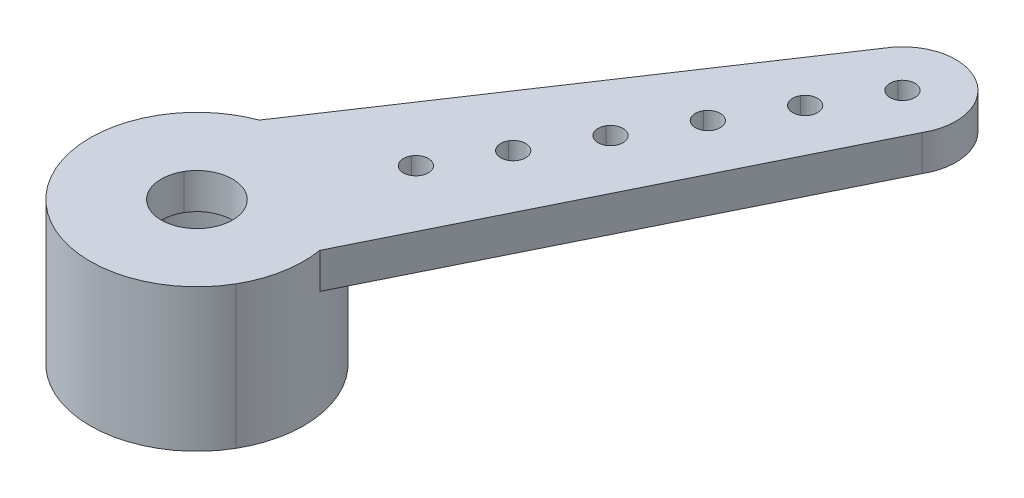
ISO-10303-21;
HEADER;
FILE_DESCRIPTION(('STEP AP214'),'2;1');
FILE_NAME('part.step','',(''),(''),'','','');
FILE_SCHEMA(('AUTOMOTIVE_DESIGN { 1 0 10303 214 1 1 1 1 }'));
ENDSEC;
DATA;
#1=APPLICATION_CONTEXT('core data for automotive mechanical design processes');
#2=APPLICATION_PROTOCOL_DEFINITION('international standard','automotive_design',2000,#1);
#3=PRODUCT_CONTEXT('',#1,'mechanical');
#4=PRODUCT('Part','Part','',(#3));
#5=PRODUCT_RELATED_PRODUCT_CATEGORY('part','',(#4));
#6=PRODUCT_DEFINITION_FORMATION('','',#4);
#7=PRODUCT_DEFINITION_CONTEXT('part definition',#1,'design');
#8=PRODUCT_DEFINITION('design','',#6,#7);
#9=PRODUCT_DEFINITION_SHAPE('','',#8);
#10=(LENGTH_UNIT() NAMED_UNIT(*) SI_UNIT(.MILLI.,.METRE.));
#11=(NAMED_UNIT(*) PLANE_ANGLE_UNIT() SI_UNIT($,.RADIAN.));
#12=(NAMED_UNIT(*) SI_UNIT($,.STERADIAN.) SOLID_ANGLE_UNIT());
#13=UNCERTAINTY_MEASURE_WITH_UNIT(LENGTH_MEASURE(1.E-05),#10,'distance_accuracy_value','');
#14=(GEOMETRIC_REPRESENTATION_CONTEXT(3) GLOBAL_UNCERTAINTY_ASSIGNED_CONTEXT((#13)) GLOBAL_UNIT_ASSIGNED_CONTEXT((#10,
#11,#12)) REPRESENTATION_CONTEXT('',''));
#15=CARTESIAN_POINT('',(0.,0.,0.));
#16=DIRECTION('',(0.,0.,1.));
#17=DIRECTION('',(1.,0.,0.));
#18=AXIS2_PLACEMENT_3D('',#15,#16,#17);
#19=CARTESIAN_POINT('',(-40.75,54.,-3.89711431703));
#20=DIRECTION('',(0.,1.,0.));
#21=DIRECTION('',(-0.866025403784329,0.,-0.50000000000019));
#22=AXIS2_PLACEMENT_3D('',#19,#20,#21);
#23=CYLINDRICAL_SURFACE('',#22,0.35);
#24=DIRECTION('',(0.,1.,0.));
#25=VECTOR('',#24,1.);
#26=CARTESIAN_POINT('',(-40.44689110867,54.,-3.72211431703));
#27=LINE('',#26,#25);
#28=CARTESIAN_POINT('',(-40.44689110867,54.,-3.72211431703));
#29=VERTEX_POINT('',#28);
#30=CARTESIAN_POINT('',(-40.44689110867,55.,-3.72211431703));
#31=VERTEX_POINT('',#30);
#32=EDGE_CURVE('E607',#29,#31,#27,.T.);
#33=ORIENTED_EDGE('',*,*,#32,.F.);
#34=CARTESIAN_POINT('',(-40.75,54.,-3.89711431703));
#35=DIRECTION('',(0.,-1.,0.));
#36=DIRECTION('',(0.866025403784329,0.,0.50000000000019));
#37=AXIS2_PLACEMENT_3D('',#34,#35,#36);
#38=CIRCLE('',#37,0.35);
#39=CARTESIAN_POINT('',(-41.05310889132,54.,-4.07211431703));
#40=VERTEX_POINT('',#39);
#41=EDGE_CURVE('E254',#29,#40,#38,.T.);
#42=ORIENTED_EDGE('',*,*,#41,.T.);
#43=DIRECTION('',(0.,1.,0.));
#44=VECTOR('',#43,1.);
#45=CARTESIAN_POINT('',(-41.05310889132,54.,-4.07211431703));
#46=LINE('',#45,#44);
#47=CARTESIAN_POINT('',(-41.05310889132,55.,-4.07211431703));
#48=VERTEX_POINT('',#47);
#49=EDGE_CURVE('E595',#40,#48,#46,.T.);
#50=ORIENTED_EDGE('',*,*,#49,.T.);
#51=CARTESIAN_POINT('',(-40.75,55.,-3.89711431703));
#52=DIRECTION('',(0.,-1.,0.));
#53=DIRECTION('',(0.866025403784329,0.,0.50000000000019));
#54=AXIS2_PLACEMENT_3D('',#51,#52,#53);
#55=CIRCLE('',#54,0.35);
#56=EDGE_CURVE('E234',#31,#48,#55,.T.);
#57=ORIENTED_EDGE('',*,*,#56,.F.);
#58=EDGE_LOOP('',(#33,#42,#50,#57));
#59=FACE_BOUND('',#58,.T.);
#60=ADVANCED_FACE('F16',(#59),#23,.F.);
#61=CARTESIAN_POINT('',(-39.75,54.,-5.629165124599));
#62=DIRECTION('',(0.,1.,0.));
#63=DIRECTION('',(-0.866025403784329,0.,-0.50000000000019));
#64=AXIS2_PLACEMENT_3D('',#61,#62,#63);
#65=CYLINDRICAL_SURFACE('',#64,0.35);
#66=DIRECTION('',(0.,1.,0.));
#67=VECTOR('',#66,1.);
#68=CARTESIAN_POINT('',(-39.44689110867,54.,-5.454165124599));
#69=LINE('',#68,#67);
#70=CARTESIAN_POINT('',(-39.44689110867,54.,-5.454165124599));
#71=VERTEX_POINT('',#70);
#72=CARTESIAN_POINT('',(-39.44689110867,55.,-5.454165124599));
#73=VERTEX_POINT('',#72);
#74=EDGE_CURVE('E579',#71,#73,#69,.T.);
#75=ORIENTED_EDGE('',*,*,#74,.F.);
#76=CARTESIAN_POINT('',(-39.75,54.,-5.629165124599));
#77=DIRECTION('',(0.,-1.,0.));
#78=DIRECTION('',(0.866025403784329,0.,0.50000000000019));
#79=AXIS2_PLACEMENT_3D('',#76,#77,#78);
#80=CIRCLE('',#79,0.35);
#81=CARTESIAN_POINT('',(-40.05310889132,54.,-5.804165124599));
#82=VERTEX_POINT('',#81);
#83=EDGE_CURVE('E241',#71,#82,#80,.T.);
#84=ORIENTED_EDGE('',*,*,#83,.T.);
#85=DIRECTION('',(0.,1.,0.));
#86=VECTOR('',#85,1.);
#87=CARTESIAN_POINT('',(-40.05310889132,54.,-5.804165124599));
#88=LINE('',#87,#86);
#89=CARTESIAN_POINT('',(-40.05310889132,55.,-5.804165124599));
#90=VERTEX_POINT('',#89);
#91=EDGE_CURVE('E568',#82,#90,#88,.T.);
#92=ORIENTED_EDGE('',*,*,#91,.T.);
#93=CARTESIAN_POINT('',(-39.75,55.,-5.629165124599));
#94=DIRECTION('',(0.,-1.,0.));
#95=DIRECTION('',(0.866025403784329,0.,0.50000000000019));
#96=AXIS2_PLACEMENT_3D('',#93,#94,#95);
#97=CIRCLE('',#96,0.35);
#98=EDGE_CURVE('E228',#73,#90,#97,.T.);
#99=ORIENTED_EDGE('',*,*,#98,.F.);
#100=EDGE_LOOP('',(#75,#84,#92,#99));
#101=FACE_BOUND('',#100,.T.);
#102=ADVANCED_FACE('F713',(#101),#65,.F.);
#103=CARTESIAN_POINT('',(-38.75,54.,-7.361215932168));
#104=DIRECTION('',(0.,1.,0.));
#105=DIRECTION('',(-0.866025403784329,0.,-0.50000000000019));
#106=AXIS2_PLACEMENT_3D('',#103,#104,#105);
#107=CYLINDRICAL_SURFACE('',#106,0.35);
#108=DIRECTION('',(0.,1.,0.));
#109=VECTOR('',#108,1.);
#110=CARTESIAN_POINT('',(-38.44689110867,54.,-7.186215932168));
#111=LINE('',#110,#109);
#112=CARTESIAN_POINT('',(-38.44689110867,54.,-7.186215932168));
#113=VERTEX_POINT('',#112);
#114=CARTESIAN_POINT('',(-38.44689110867,55.,-7.186215932168));
#115=VERTEX_POINT('',#114);
#116=EDGE_CURVE('E556',#113,#115,#111,.T.);
#117=ORIENTED_EDGE('',*,*,#116,.F.);
#118=CARTESIAN_POINT('',(-38.75,54.,-7.361215932168));
#119=DIRECTION('',(0.,-1.,0.));
#120=DIRECTION('',(0.866025403784329,0.,0.50000000000019));
#121=AXIS2_PLACEMENT_3D('',#118,#119,#120);
#122=CIRCLE('',#121,0.35);
#123=CARTESIAN_POINT('',(-39.05310889132,54.,-7.536215932168));
#124=VERTEX_POINT('',#123);
#125=EDGE_CURVE('E252',#113,#124,#122,.T.);
#126=ORIENTED_EDGE('',*,*,#125,.T.);
#127=DIRECTION('',(0.,1.,0.));
#128=VECTOR('',#127,1.);
#129=CARTESIAN_POINT('',(-39.05310889132,54.,-7.536215932168));
#130=LINE('',#129,#128);
#131=CARTESIAN_POINT('',(-39.05310889132,55.,-7.536215932168));
#132=VERTEX_POINT('',#131);
#133=EDGE_CURVE('E545',#124,#132,#130,.T.);
#134=ORIENTED_EDGE('',*,*,#133,.T.);
#135=CARTESIAN_POINT('',(-38.75,55.,-7.361215932168));
#136=DIRECTION('',(0.,-1.,0.));
#137=DIRECTION('',(0.866025403784329,0.,0.50000000000019));
#138=AXIS2_PLACEMENT_3D('',#135,#136,#137);
#139=CIRCLE('',#138,0.35);
#140=EDGE_CURVE('E226',#115,#132,#139,.T.);
#141=ORIENTED_EDGE('',*,*,#140,.F.);
#142=EDGE_LOOP('',(#117,#126,#134,#141));
#143=FACE_BOUND('',#142,.T.);
#144=ADVANCED_FACE('F676',(#143),#107,.F.);
#145=CARTESIAN_POINT('',(-37.75,54.,-9.093266739737));
#146=DIRECTION('',(0.,1.,0.));
#147=DIRECTION('',(-0.866025403784329,0.,-0.50000000000019));
#148=AXIS2_PLACEMENT_3D('',#145,#146,#147);
#149=CYLINDRICAL_SURFACE('',#148,0.35);
#150=DIRECTION('',(0.,1.,0.));
#151=VECTOR('',#150,1.);
#152=CARTESIAN_POINT('',(-37.44689110867,54.,-8.918266739737));
#153=LINE('',#152,#151);
#154=CARTESIAN_POINT('',(-37.44689110867,54.,-8.918266739737));
#155=VERTEX_POINT('',#154);
#156=CARTESIAN_POINT('',(-37.44689110867,55.,-8.918266739737));
#157=VERTEX_POINT('',#156);
#158=EDGE_CURVE('E528',#155,#157,#153,.T.);
#159=ORIENTED_EDGE('',*,*,#158,.F.);
#160=CARTESIAN_POINT('',(-37.75,54.,-9.093266739737));
#161=DIRECTION('',(0.,-1.,0.));
#162=DIRECTION('',(0.866025403784329,0.,0.50000000000019));
#163=AXIS2_PLACEMENT_3D('',#160,#161,#162);
#164=CIRCLE('',#163,0.35);
#165=CARTESIAN_POINT('',(-38.05310889132,54.,-9.268266739737));
#166=VERTEX_POINT('',#165);
#167=EDGE_CURVE('E244',#155,#166,#164,.T.);
#168=ORIENTED_EDGE('',*,*,#167,.T.);
#169=DIRECTION('',(0.,1.,0.));
#170=VECTOR('',#169,1.);
#171=CARTESIAN_POINT('',(-38.05310889132,54.,-9.268266739737));
#172=LINE('',#171,#170);
#173=CARTESIAN_POINT('',(-38.05310889132,55.,-9.268266739737));
#174=VERTEX_POINT('',#173);
#175=EDGE_CURVE('E511',#166,#174,#172,.T.);
#176=ORIENTED_EDGE('',*,*,#175,.T.);
#177=CARTESIAN_POINT('',(-37.75,55.,-9.093266739737));
#178=DIRECTION('',(0.,-1.,0.));
#179=DIRECTION('',(0.866025403784329,0.,0.50000000000019));
#180=AXIS2_PLACEMENT_3D('',#177,#178,#179);
#181=CIRCLE('',#180,0.35);
#182=EDGE_CURVE('E225',#157,#174,#181,.T.);
#183=ORIENTED_EDGE('',*,*,#182,.F.);
#184=EDGE_LOOP('',(#159,#168,#176,#183));
#185=FACE_BOUND('',#184,.T.);
#186=ADVANCED_FACE('F770',(#185),#149,.F.);
#187=CARTESIAN_POINT('',(-36.75,54.,-10.8253175473));
#188=DIRECTION('',(0.,1.,0.));
#189=DIRECTION('',(-0.866025403784329,0.,-0.50000000000019));
#190=AXIS2_PLACEMENT_3D('',#187,#188,#189);
#191=CYLINDRICAL_SURFACE('',#190,0.35);
#192=DIRECTION('',(0.,1.,0.));
#193=VECTOR('',#192,1.);
#194=CARTESIAN_POINT('',(-36.44689110867,54.,-10.6503175473));
#195=LINE('',#194,#193);
#196=CARTESIAN_POINT('',(-36.44689110867,54.,-10.6503175473));
#197=VERTEX_POINT('',#196);
#198=CARTESIAN_POINT('',(-36.44689110867,55.,-10.6503175473));
#199=VERTEX_POINT('',#198);
#200=EDGE_CURVE('E500',#197,#199,#195,.T.);
#201=ORIENTED_EDGE('',*,*,#200,.F.);
#202=CARTESIAN_POINT('',(-36.75,54.,-10.8253175473));
#203=DIRECTION('',(0.,-1.,0.));
#204=DIRECTION('',(0.866025403784329,0.,0.50000000000019));
#205=AXIS2_PLACEMENT_3D('',#202,#203,#204);
#206=CIRCLE('',#205,0.35);
#207=CARTESIAN_POINT('',(-37.05310889132,54.,-11.0003175473));
#208=VERTEX_POINT('',#207);
#209=EDGE_CURVE('E258',#197,#208,#206,.T.);
#210=ORIENTED_EDGE('',*,*,#209,.T.);
#211=DIRECTION('',(0.,1.,0.));
#212=VECTOR('',#211,1.);
#213=CARTESIAN_POINT('',(-37.05310889132,54.,-11.0003175473));
#214=LINE('',#213,#212);
#215=CARTESIAN_POINT('',(-37.05310889132,55.,-11.0003175473));
#216=VERTEX_POINT('',#215);
#217=EDGE_CURVE('E481',#208,#216,#214,.T.);
#218=ORIENTED_EDGE('',*,*,#217,.T.);
#219=CARTESIAN_POINT('',(-36.75,55.,-10.8253175473));
#220=DIRECTION('',(0.,-1.,0.));
#221=DIRECTION('',(0.866025403784329,0.,0.50000000000019));
#222=AXIS2_PLACEMENT_3D('',#219,#220,#221);
#223=CIRCLE('',#222,0.35);
#224=EDGE_CURVE('E222',#199,#216,#223,.T.);
#225=ORIENTED_EDGE('',*,*,#224,.F.);
#226=EDGE_LOOP('',(#201,#210,#218,#225));
#227=FACE_BOUND('',#226,.T.);
#228=ADVANCED_FACE('F769',(#227),#191,.F.);
#229=CARTESIAN_POINT('',(-35.75,54.,-12.55736835487));
#230=DIRECTION('',(0.,1.,0.));
#231=DIRECTION('',(-0.866025403784329,0.,-0.50000000000019));
#232=AXIS2_PLACEMENT_3D('',#229,#230,#231);
#233=CYLINDRICAL_SURFACE('',#232,0.35);
#234=DIRECTION('',(0.,1.,0.));
#235=VECTOR('',#234,1.);
#236=CARTESIAN_POINT('',(-35.44689110867,54.,-12.38236835487));
#237=LINE('',#236,#235);
#238=CARTESIAN_POINT('',(-35.44689110867,54.,-12.38236835487));
#239=VERTEX_POINT('',#238);
#240=CARTESIAN_POINT('',(-35.44689110867,55.,-12.38236835487));
#241=VERTEX_POINT('',#240);
#242=EDGE_CURVE('E463',#239,#241,#237,.T.);
#243=ORIENTED_EDGE('',*,*,#242,.F.);
#244=CARTESIAN_POINT('',(-35.75,54.,-12.55736835487));
#245=DIRECTION('',(0.,-1.,0.));
#246=DIRECTION('',(0.866025403784329,0.,0.50000000000019));
#247=AXIS2_PLACEMENT_3D('',#244,#245,#246);
#248=CIRCLE('',#247,0.35);
#249=CARTESIAN_POINT('',(-36.05310889132,54.,-12.73236835487));
#250=VERTEX_POINT('',#249);
#251=EDGE_CURVE('E248',#239,#250,#248,.T.);
#252=ORIENTED_EDGE('',*,*,#251,.T.);
#253=DIRECTION('',(0.,1.,0.));
#254=VECTOR('',#253,1.);
#255=CARTESIAN_POINT('',(-36.05310889132,54.,-12.73236835487));
#256=LINE('',#255,#254);
#257=CARTESIAN_POINT('',(-36.05310889132,55.,-12.73236835487));
#258=VERTEX_POINT('',#257);
#259=EDGE_CURVE('E453',#250,#258,#256,.T.);
#260=ORIENTED_EDGE('',*,*,#259,.T.);
#261=CARTESIAN_POINT('',(-35.75,55.,-12.55736835487));
#262=DIRECTION('',(0.,-1.,0.));
#263=DIRECTION('',(0.866025403784329,0.,0.50000000000019));
#264=AXIS2_PLACEMENT_3D('',#261,#262,#263);
#265=CIRCLE('',#264,0.35);
#266=EDGE_CURVE('E217',#241,#258,#265,.T.);
#267=ORIENTED_EDGE('',*,*,#266,.F.);
#268=EDGE_LOOP('',(#243,#252,#260,#267));
#269=FACE_BOUND('',#268,.T.);
#270=ADVANCED_FACE('F700',(#269),#233,.F.);
#271=CARTESIAN_POINT('',(-37.04903810567,54.,-13.30736835487));
#272=DIRECTION('',(0.831770328724975,0.,0.555119915200983));
#273=DIRECTION('',(0.,-1.,0.));
#274=AXIS2_PLACEMENT_3D('',#271,#272,#273);
#275=PLANE('',#274);
#276=DIRECTION('',(0.555119915200983,0.,-0.831770328724975));
#277=VECTOR('',#276,1.);
#278=CARTESIAN_POINT('',(-37.04903810567,55.,-13.30736835487));
#279=LINE('',#278,#277);
#280=CARTESIAN_POINT('',(-44.0563619338,55.,-2.807863861516));
#281=VERTEX_POINT('',#280);
#282=CARTESIAN_POINT('',(-37.04903810567,55.,-13.30736835487));
#283=VERTEX_POINT('',#282);
#284=EDGE_CURVE('E214',#281,#283,#279,.T.);
#285=ORIENTED_EDGE('',*,*,#284,.T.);
#286=DIRECTION('',(0.,1.,0.));
#287=VECTOR('',#286,1.);
#288=CARTESIAN_POINT('',(-37.04903810567,54.,-13.30736835487));
#289=LINE('',#288,#287);
#290=CARTESIAN_POINT('',(-37.04903810567,54.,-13.30736835487));
#291=VERTEX_POINT('',#290);
#292=EDGE_CURVE('E11',#291,#283,#289,.T.);
#293=ORIENTED_EDGE('',*,*,#292,.F.);
#294=DIRECTION('',(0.555119915200983,0.,-0.831770328724975));
#295=VECTOR('',#294,1.);
#296=CARTESIAN_POINT('',(-37.04903810567,54.,-13.30736835487));
#297=LINE('',#296,#295);
#298=CARTESIAN_POINT('',(-44.0563619338,54.,-2.807863861516));
#299=VERTEX_POINT('',#298);
#300=EDGE_CURVE('E257',#299,#291,#297,.T.);
#301=ORIENTED_EDGE('',*,*,#300,.F.);
#302=DIRECTION('',(0.,1.,0.));
#303=VECTOR('',#302,1.);
#304=CARTESIAN_POINT('',(-44.0563619338,54.,-2.807863861516));
#305=LINE('',#304,#303);
#306=EDGE_CURVE('E210',#299,#281,#305,.T.);
#307=ORIENTED_EDGE('',*,*,#306,.T.);
#308=EDGE_LOOP('',(#285,#293,#301,#307));
#309=FACE_BOUND('',#308,.T.);
#310=ADVANCED_FACE('F791',(#309),#275,.F.);
#311=CARTESIAN_POINT('',(-34.45096189432,54.,-11.80736835487));
#312=DIRECTION('',(-0.896626687264948,0.,-0.442787289433974));
#313=DIRECTION('',(-0.442787289433974,0.,0.896626687264948));
#314=AXIS2_PLACEMENT_3D('',#311,#312,#313);
#315=PLANE('',#314);
#316=DIRECTION('',(-0.442787289433974,0.,0.896626687264948));
#317=VECTOR('',#316,1.);
#318=CARTESIAN_POINT('',(-34.45096189432,55.,-11.80736835487));
#319=LINE('',#318,#317);
#320=CARTESIAN_POINT('',(-34.45096189432,55.,-11.80736835487));
#321=VERTEX_POINT('',#320);
#322=CARTESIAN_POINT('',(-40.04018883558,55.,-0.489405630337));
#323=VERTEX_POINT('',#322);
#324=EDGE_CURVE('E174',#321,#323,#319,.T.);
#325=ORIENTED_EDGE('',*,*,#324,.T.);
#326=DIRECTION('',(0.,1.,0.));
#327=VECTOR('',#326,1.);
#328=CARTESIAN_POINT('',(-40.04018883558,54.,-0.489405630337));
#329=LINE('',#328,#327);
#330=CARTESIAN_POINT('',(-40.04018883558,54.,-0.489405630337));
#331=VERTEX_POINT('',#330);
#332=EDGE_CURVE('E180',#331,#323,#329,.T.);
#333=ORIENTED_EDGE('',*,*,#332,.F.);
#334=DIRECTION('',(-0.442787289433974,0.,0.896626687264948));
#335=VECTOR('',#334,1.);
#336=CARTESIAN_POINT('',(-34.45096189432,54.,-11.80736835487));
#337=LINE('',#336,#335);
#338=CARTESIAN_POINT('',(-34.45096189432,54.,-11.80736835487));
#339=VERTEX_POINT('',#338);
#340=EDGE_CURVE('E260',#339,#331,#337,.T.);
#341=ORIENTED_EDGE('',*,*,#340,.F.);
#342=DIRECTION('',(0.,1.,0.));
#343=VECTOR('',#342,1.);
#344=CARTESIAN_POINT('',(-34.45096189432,54.,-11.80736835487));
#345=LINE('',#344,#343);
#346=EDGE_CURVE('E24',#339,#321,#345,.T.);
#347=ORIENTED_EDGE('',*,*,#346,.T.);
#348=EDGE_LOOP('',(#325,#333,#341,#347));
#349=FACE_BOUND('',#348,.T.);
#350=ADVANCED_FACE('F175',(#349),#315,.F.);
#351=CARTESIAN_POINT('',(-35.75,54.,-12.55736835487));
#352=DIRECTION('',(0.,1.,0.));
#353=DIRECTION('',(-0.866025403784329,0.,-0.50000000000019));
#354=AXIS2_PLACEMENT_3D('',#351,#352,#353);
#355=CYLINDRICAL_SURFACE('',#354,1.5);
#356=CARTESIAN_POINT('',(-35.75,55.,-12.55736835487));
#357=DIRECTION('',(0.,-1.,0.));
#358=DIRECTION('',(0.866025403784329,0.,0.50000000000019));
#359=AXIS2_PLACEMENT_3D('',#356,#357,#358);
#360=CIRCLE('',#359,1.5);
#361=EDGE_CURVE('E181',#283,#321,#360,.T.);
#362=ORIENTED_EDGE('',*,*,#361,.T.);
#363=ORIENTED_EDGE('',*,*,#346,.F.);
#364=CARTESIAN_POINT('',(-35.75,54.,-12.55736835487));
#365=DIRECTION('',(0.,-1.,0.));
#366=DIRECTION('',(0.866025403784329,0.,0.50000000000019));
#367=AXIS2_PLACEMENT_3D('',#364,#365,#366);
#368=CIRCLE('',#367,1.5);
#369=EDGE_CURVE('E253',#291,#339,#368,.T.);
#370=ORIENTED_EDGE('',*,*,#369,.F.);
#371=ORIENTED_EDGE('',*,*,#292,.T.);
#372=EDGE_LOOP('',(#362,#363,#370,#371));
#373=FACE_BOUND('',#372,.T.);
#374=ADVANCED_FACE('F705',(#373),#355,.T.);
#375=CARTESIAN_POINT('',(-35.75,54.,-12.55736835487));
#376=DIRECTION('',(0.,-1.,0.));
#377=DIRECTION('',(-1.,0.,0.));
#378=AXIS2_PLACEMENT_3D('',#375,#376,#377);
#379=PLANE('',#378);
#380=CARTESIAN_POINT('',(-40.75,54.,-3.89711431703));
#381=DIRECTION('',(0.,-1.,0.));
#382=DIRECTION('',(0.866025403784329,0.,0.50000000000019));
#383=AXIS2_PLACEMENT_3D('',#380,#381,#382);
#384=CIRCLE('',#383,0.35);
#385=EDGE_CURVE('E614',#40,#29,#384,.T.);
#386=ORIENTED_EDGE('',*,*,#385,.F.);
#387=ORIENTED_EDGE('',*,*,#41,.F.);
#388=EDGE_LOOP('',(#386,#387));
#389=FACE_BOUND('',#388,.T.);
#390=CARTESIAN_POINT('',(-38.75,54.,-7.361215932168));
#391=DIRECTION('',(0.,-1.,0.));
#392=DIRECTION('',(0.866025403784329,0.,0.50000000000019));
#393=AXIS2_PLACEMENT_3D('',#390,#391,#392);
#394=CIRCLE('',#393,0.35);
#395=EDGE_CURVE('E565',#124,#113,#394,.T.);
#396=ORIENTED_EDGE('',*,*,#395,.F.);
#397=ORIENTED_EDGE('',*,*,#125,.F.);
#398=EDGE_LOOP('',(#396,#397));
#399=FACE_BOUND('',#398,.T.);
#400=CARTESIAN_POINT('',(-36.75,54.,-10.8253175473));
#401=DIRECTION('',(0.,-1.,0.));
#402=DIRECTION('',(0.866025403784329,0.,0.50000000000019));
#403=AXIS2_PLACEMENT_3D('',#400,#401,#402);
#404=CIRCLE('',#403,0.35);
#405=EDGE_CURVE('E503',#208,#197,#404,.T.);
#406=ORIENTED_EDGE('',*,*,#405,.F.);
#407=ORIENTED_EDGE('',*,*,#209,.F.);
#408=EDGE_LOOP('',(#406,#407));
#409=FACE_BOUND('',#408,.T.);
#410=ORIENTED_EDGE('',*,*,#369,.T.);
#411=ORIENTED_EDGE('',*,*,#340,.T.);
#412=CARTESIAN_POINT('',(-43.,54.,0.));
#413=DIRECTION('',(0.,1.,0.));
#414=DIRECTION('',(0.866025403784329,0.,0.50000000000019));
#415=AXIS2_PLACEMENT_3D('',#412,#413,#414);
#416=CIRCLE('',#415,3.);
#417=EDGE_CURVE('E199',#331,#299,#416,.T.);
#418=ORIENTED_EDGE('',*,*,#417,.T.);
#419=ORIENTED_EDGE('',*,*,#300,.T.);
#420=EDGE_LOOP('',(#410,#411,#418,#419));
#421=FACE_BOUND('',#420,.T.);
#422=CARTESIAN_POINT('',(-35.75,54.,-12.55736835487));
#423=DIRECTION('',(0.,-1.,0.));
#424=DIRECTION('',(0.866025403784329,0.,0.50000000000019));
#425=AXIS2_PLACEMENT_3D('',#422,#423,#424);
#426=CIRCLE('',#425,0.35);
#427=EDGE_CURVE('E475',#250,#239,#426,.T.);
#428=ORIENTED_EDGE('',*,*,#427,.F.);
#429=ORIENTED_EDGE('',*,*,#251,.F.);
#430=EDGE_LOOP('',(#428,#429));
#431=FACE_BOUND('',#430,.T.);
#432=CARTESIAN_POINT('',(-37.75,54.,-9.093266739737));
#433=DIRECTION('',(0.,-1.,0.));
#434=DIRECTION('',(0.866025403784329,0.,0.50000000000019));
#435=AXIS2_PLACEMENT_3D('',#432,#433,#434);
#436=CIRCLE('',#435,0.35);
#437=EDGE_CURVE('E531',#166,#155,#436,.T.);
#438=ORIENTED_EDGE('',*,*,#437,.F.);
#439=ORIENTED_EDGE('',*,*,#167,.F.);
#440=EDGE_LOOP('',(#438,#439));
#441=FACE_BOUND('',#440,.T.);
#442=CARTESIAN_POINT('',(-39.75,54.,-5.629165124599));
#443=DIRECTION('',(0.,-1.,0.));
#444=DIRECTION('',(0.866025403784329,0.,0.50000000000019));
#445=AXIS2_PLACEMENT_3D('',#442,#443,#444);
#446=CIRCLE('',#445,0.35);
#447=EDGE_CURVE('E588',#82,#71,#446,.T.);
#448=ORIENTED_EDGE('',*,*,#447,.F.);
#449=ORIENTED_EDGE('',*,*,#83,.F.);
#450=EDGE_LOOP('',(#448,#449));
#451=FACE_BOUND('',#450,.T.);
#452=ADVANCED_FACE('F674',(#389,#399,#409,#421,#431,#441,#451),#379,.T.);
#453=CARTESIAN_POINT('',(-43.,51.,0.));
#454=DIRECTION('',(0.,1.,0.));
#455=DIRECTION('',(-0.866025403784329,0.,-0.50000000000019));
#456=AXIS2_PLACEMENT_3D('',#453,#454,#455);
#457=CYLINDRICAL_SURFACE('',#456,1.);
#458=DIRECTION('',(0.,1.,0.));
#459=VECTOR('',#458,1.);
#460=CARTESIAN_POINT('',(-42.13397459621,51.,0.5));
#461=LINE('',#460,#459);
#462=CARTESIAN_POINT('',(-42.13397459621,54.,0.5));
#463=VERTEX_POINT('',#462);
#464=CARTESIAN_POINT('',(-42.13397459621,55.,0.5));
#465=VERTEX_POINT('',#464);
#466=EDGE_CURVE('E442',#463,#465,#461,.T.);
#467=ORIENTED_EDGE('',*,*,#466,.F.);
#468=CARTESIAN_POINT('',(-43.,54.,0.));
#469=DIRECTION('',(0.,-1.,0.));
#470=DIRECTION('',(0.866025403784329,0.,0.50000000000019));
#471=AXIS2_PLACEMENT_3D('',#468,#469,#470);
#472=CIRCLE('',#471,1.);
#473=CARTESIAN_POINT('',(-43.86602540378,54.,-0.5));
#474=VERTEX_POINT('',#473);
#475=EDGE_CURVE('E238',#463,#474,#472,.T.);
#476=ORIENTED_EDGE('',*,*,#475,.T.);
#477=DIRECTION('',(0.,1.,0.));
#478=VECTOR('',#477,1.);
#479=CARTESIAN_POINT('',(-43.86602540378,51.,-0.5));
#480=LINE('',#479,#478);
#481=CARTESIAN_POINT('',(-43.86602540378,55.,-0.5));
#482=VERTEX_POINT('',#481);
#483=EDGE_CURVE('E430',#474,#482,#480,.T.);
#484=ORIENTED_EDGE('',*,*,#483,.T.);
#485=CARTESIAN_POINT('',(-43.,55.,0.));
#486=DIRECTION('',(0.,1.,0.));
#487=DIRECTION('',(-0.866025403784329,0.,-0.50000000000019));
#488=AXIS2_PLACEMENT_3D('',#485,#486,#487);
#489=CIRCLE('',#488,1.);
#490=EDGE_CURVE('E183',#482,#465,#489,.T.);
#491=ORIENTED_EDGE('',*,*,#490,.T.);
#492=EDGE_LOOP('',(#467,#476,#484,#491));
#493=FACE_BOUND('',#492,.T.);
#494=ADVANCED_FACE('F701',(#493),#457,.F.);
#495=CARTESIAN_POINT('',(-43.,54.,0.));
#496=DIRECTION('',(0.,-1.,0.));
#497=DIRECTION('',(-1.,0.,0.));
#498=AXIS2_PLACEMENT_3D('',#495,#496,#497);
#499=PLANE('',#498);
#500=CARTESIAN_POINT('',(-43.,54.,0.));
#501=DIRECTION('',(0.,-1.,0.));
#502=DIRECTION('',(0.866025403784329,0.,0.50000000000019));
#503=AXIS2_PLACEMENT_3D('',#500,#501,#502);
#504=CIRCLE('',#503,2.5);
#505=CARTESIAN_POINT('',(-40.83493649053,54.,1.25));
#506=VERTEX_POINT('',#505);
#507=CARTESIAN_POINT('',(-45.16506350946,54.,-1.25));
#508=VERTEX_POINT('',#507);
#509=EDGE_CURVE('E231',#506,#508,#504,.T.);
#510=ORIENTED_EDGE('',*,*,#509,.T.);
#511=CARTESIAN_POINT('',(-43.,54.,0.));
#512=DIRECTION('',(0.,-1.,0.));
#513=DIRECTION('',(0.866025403784329,0.,0.50000000000019));
#514=AXIS2_PLACEMENT_3D('',#511,#512,#513);
#515=CIRCLE('',#514,2.5);
#516=EDGE_CURVE('E419',#508,#506,#515,.T.);
#517=ORIENTED_EDGE('',*,*,#516,.T.);
#518=EDGE_LOOP('',(#510,#517));
#519=FACE_BOUND('',#518,.T.);
#520=CARTESIAN_POINT('',(-43.,54.,0.));
#521=DIRECTION('',(0.,-1.,0.));
#522=DIRECTION('',(0.866025403784329,0.,0.50000000000019));
#523=AXIS2_PLACEMENT_3D('',#520,#521,#522);
#524=CIRCLE('',#523,1.);
#525=EDGE_CURVE('E449',#474,#463,#524,.T.);
#526=ORIENTED_EDGE('',*,*,#525,.F.);
#527=ORIENTED_EDGE('',*,*,#475,.F.);
#528=EDGE_LOOP('',(#526,#527));
#529=FACE_BOUND('',#528,.T.);
#530=ADVANCED_FACE('F641',(#519,#529),#499,.T.);
#531=CARTESIAN_POINT('',(-43.,54.,0.));
#532=DIRECTION('',(0.,-1.,0.));
#533=DIRECTION('',(0.866025403784329,0.,0.50000000000019));
#534=AXIS2_PLACEMENT_3D('',#531,#532,#533);
#535=CYLINDRICAL_SURFACE('',#534,2.5);
#536=DIRECTION('',(0.,-1.,0.));
#537=VECTOR('',#536,1.);
#538=CARTESIAN_POINT('',(-45.16506350946,54.,-1.25));
#539=LINE('',#538,#537);
#540=CARTESIAN_POINT('',(-45.16506350946,51.,-1.25));
#541=VERTEX_POINT('',#540);
#542=EDGE_CURVE('E414',#508,#541,#539,.T.);
#543=ORIENTED_EDGE('',*,*,#542,.F.);
#544=ORIENTED_EDGE('',*,*,#509,.F.);
#545=DIRECTION('',(0.,-1.,0.));
#546=VECTOR('',#545,1.);
#547=CARTESIAN_POINT('',(-40.83493649053,54.,1.25));
#548=LINE('',#547,#546);
#549=CARTESIAN_POINT('',(-40.83493649053,51.,1.25));
#550=VERTEX_POINT('',#549);
#551=EDGE_CURVE('E402',#506,#550,#548,.T.);
#552=ORIENTED_EDGE('',*,*,#551,.T.);
#553=CARTESIAN_POINT('',(-43.,51.,0.));
#554=DIRECTION('',(0.,-1.,0.));
#555=DIRECTION('',(0.866025403784329,0.,0.50000000000019));
#556=AXIS2_PLACEMENT_3D('',#553,#554,#555);
#557=CIRCLE('',#556,2.5);
#558=EDGE_CURVE('E194',#550,#541,#557,.T.);
#559=ORIENTED_EDGE('',*,*,#558,.T.);
#560=EDGE_LOOP('',(#543,#544,#552,#559));
#561=FACE_BOUND('',#560,.T.);
#562=ADVANCED_FACE('F643',(#561),#535,.F.);
#563=CARTESIAN_POINT('',(-43.,55.,0.));
#564=DIRECTION('',(0.,-1.,0.));
#565=DIRECTION('',(-1.,0.,0.));
#566=AXIS2_PLACEMENT_3D('',#563,#564,#565);
#567=PLANE('',#566);
#568=CARTESIAN_POINT('',(-40.75,55.,-3.89711431703));
#569=DIRECTION('',(0.,-1.,0.));
#570=DIRECTION('',(0.866025403784329,0.,0.50000000000019));
#571=AXIS2_PLACEMENT_3D('',#568,#569,#570);
#572=CIRCLE('',#571,0.35);
#573=EDGE_CURVE('E597',#48,#31,#572,.T.);
#574=ORIENTED_EDGE('',*,*,#573,.T.);
#575=ORIENTED_EDGE('',*,*,#56,.T.);
#576=EDGE_LOOP('',(#574,#575));
#577=FACE_BOUND('',#576,.T.);
#578=CARTESIAN_POINT('',(-39.75,55.,-5.629165124599));
#579=DIRECTION('',(0.,-1.,0.));
#580=DIRECTION('',(0.866025403784329,0.,0.50000000000019));
#581=AXIS2_PLACEMENT_3D('',#578,#579,#580);
#582=CIRCLE('',#581,0.35);
#583=EDGE_CURVE('E573',#90,#73,#582,.T.);
#584=ORIENTED_EDGE('',*,*,#583,.T.);
#585=ORIENTED_EDGE('',*,*,#98,.T.);
#586=EDGE_LOOP('',(#584,#585));
#587=FACE_BOUND('',#586,.T.);
#588=CARTESIAN_POINT('',(-38.75,55.,-7.361215932168));
#589=DIRECTION('',(0.,-1.,0.));
#590=DIRECTION('',(0.866025403784329,0.,0.50000000000019));
#591=AXIS2_PLACEMENT_3D('',#588,#589,#590);
#592=CIRCLE('',#591,0.35);
#593=EDGE_CURVE('E549',#132,#115,#592,.T.);
#594=ORIENTED_EDGE('',*,*,#593,.T.);
#595=ORIENTED_EDGE('',*,*,#140,.T.);
#596=EDGE_LOOP('',(#594,#595));
#597=FACE_BOUND('',#596,.T.);
#598=CARTESIAN_POINT('',(-37.75,55.,-9.093266739737));
#599=DIRECTION('',(0.,-1.,0.));
#600=DIRECTION('',(0.866025403784329,0.,0.50000000000019));
#601=AXIS2_PLACEMENT_3D('',#598,#599,#600);
#602=CIRCLE('',#601,0.35);
#603=EDGE_CURVE('E518',#174,#157,#602,.T.);
#604=ORIENTED_EDGE('',*,*,#603,.T.);
#605=ORIENTED_EDGE('',*,*,#182,.T.);
#606=EDGE_LOOP('',(#604,#605));
#607=FACE_BOUND('',#606,.T.);
#608=CARTESIAN_POINT('',(-36.75,55.,-10.8253175473));
#609=DIRECTION('',(0.,-1.,0.));
#610=DIRECTION('',(0.866025403784329,0.,0.50000000000019));
#611=AXIS2_PLACEMENT_3D('',#608,#609,#610);
#612=CIRCLE('',#611,0.35);
#613=EDGE_CURVE('E487',#216,#199,#612,.T.);
#614=ORIENTED_EDGE('',*,*,#613,.T.);
#615=ORIENTED_EDGE('',*,*,#224,.T.);
#616=EDGE_LOOP('',(#614,#615));
#617=FACE_BOUND('',#616,.T.);
#618=CARTESIAN_POINT('',(-35.75,55.,-12.55736835487));
#619=DIRECTION('',(0.,-1.,0.));
#620=DIRECTION('',(0.866025403784329,0.,0.50000000000019));
#621=AXIS2_PLACEMENT_3D('',#618,#619,#620);
#622=CIRCLE('',#621,0.35);
#623=EDGE_CURVE('E457',#258,#241,#622,.T.);
#624=ORIENTED_EDGE('',*,*,#623,.T.);
#625=ORIENTED_EDGE('',*,*,#266,.T.);
#626=EDGE_LOOP('',(#624,#625));
#627=FACE_BOUND('',#626,.T.);
#628=CARTESIAN_POINT('',(-43.,55.,0.));
#629=DIRECTION('',(0.,-1.,0.));
#630=DIRECTION('',(0.866025403784329,0.,0.50000000000019));
#631=AXIS2_PLACEMENT_3D('',#628,#629,#630);
#632=CIRCLE('',#631,3.);
#633=CARTESIAN_POINT('',(-40.40192378864,55.,1.5));
#634=VERTEX_POINT('',#633);
#635=EDGE_CURVE('E186',#323,#634,#632,.T.);
#636=ORIENTED_EDGE('',*,*,#635,.F.);
#637=ORIENTED_EDGE('',*,*,#324,.F.);
#638=ORIENTED_EDGE('',*,*,#361,.F.);
#639=ORIENTED_EDGE('',*,*,#284,.F.);
#640=CARTESIAN_POINT('',(-43.,55.,0.));
#641=DIRECTION('',(0.,-1.,0.));
#642=DIRECTION('',(0.866025403784329,0.,0.50000000000019));
#643=AXIS2_PLACEMENT_3D('',#640,#641,#642);
#644=CIRCLE('',#643,3.);
#645=CARTESIAN_POINT('',(-45.59807621135,55.,-1.5));
#646=VERTEX_POINT('',#645);
#647=EDGE_CURVE('E369',#646,#281,#644,.T.);
#648=ORIENTED_EDGE('',*,*,#647,.F.);
#649=CARTESIAN_POINT('',(-43.,55.,0.));
#650=DIRECTION('',(0.,-1.,0.));
#651=DIRECTION('',(0.866025403784329,0.,0.50000000000019));
#652=AXIS2_PLACEMENT_3D('',#649,#650,#651);
#653=CIRCLE('',#652,3.);
#654=EDGE_CURVE('E189',#634,#646,#653,.T.);
#655=ORIENTED_EDGE('',*,*,#654,.F.);
#656=EDGE_LOOP('',(#636,#637,#638,#639,#648,#655));
#657=FACE_BOUND('',#656,.T.);
#658=ORIENTED_EDGE('',*,*,#490,.F.);
#659=CARTESIAN_POINT('',(-43.,55.,0.));
#660=DIRECTION('',(0.,1.,0.));
#661=DIRECTION('',(-0.866025403784329,0.,-0.50000000000019));
#662=AXIS2_PLACEMENT_3D('',#659,#660,#661);
#663=CIRCLE('',#662,1.);
#664=EDGE_CURVE('E432',#465,#482,#663,.T.);
#665=ORIENTED_EDGE('',*,*,#664,.F.);
#666=EDGE_LOOP('',(#658,#665));
#667=FACE_BOUND('',#666,.T.);
#668=ADVANCED_FACE('F190',(#577,#587,#597,#607,#617,#627,#657,#667),#567,.F.);
#669=CARTESIAN_POINT('',(-43.,51.,0.));
#670=DIRECTION('',(0.,-1.,0.));
#671=DIRECTION('',(-1.,0.,0.));
#672=AXIS2_PLACEMENT_3D('',#669,#670,#671);
#673=PLANE('',#672);
#674=CARTESIAN_POINT('',(-43.,51.,0.));
#675=DIRECTION('',(0.,-1.,0.));
#676=DIRECTION('',(0.866025403784329,0.,0.50000000000019));
#677=AXIS2_PLACEMENT_3D('',#674,#675,#676);
#678=CIRCLE('',#677,3.);
#679=CARTESIAN_POINT('',(-45.59807621135,51.,-1.5));
#680=VERTEX_POINT('',#679);
#681=CARTESIAN_POINT('',(-40.40192378864,51.,1.5));
#682=VERTEX_POINT('',#681);
#683=EDGE_CURVE('E372',#680,#682,#678,.T.);
#684=ORIENTED_EDGE('',*,*,#683,.T.);
#685=CARTESIAN_POINT('',(-43.,51.,0.));
#686=DIRECTION('',(0.,-1.,0.));
#687=DIRECTION('',(0.866025403784329,0.,0.50000000000019));
#688=AXIS2_PLACEMENT_3D('',#685,#686,#687);
#689=CIRCLE('',#688,3.);
#690=EDGE_CURVE('E400',#682,#680,#689,.T.);
#691=ORIENTED_EDGE('',*,*,#690,.T.);
#692=EDGE_LOOP('',(#684,#691));
#693=FACE_BOUND('',#692,.T.);
#694=ORIENTED_EDGE('',*,*,#558,.F.);
#695=CARTESIAN_POINT('',(-43.,51.,0.));
#696=DIRECTION('',(0.,-1.,0.));
#697=DIRECTION('',(0.866025403784329,0.,0.50000000000019));
#698=AXIS2_PLACEMENT_3D('',#695,#696,#697);
#699=CIRCLE('',#698,2.5);
#700=EDGE_CURVE('E411',#541,#550,#699,.T.);
#701=ORIENTED_EDGE('',*,*,#700,.F.);
#702=EDGE_LOOP('',(#694,#701));
#703=FACE_BOUND('',#702,.T.);
#704=ADVANCED_FACE('F640',(#693,#703),#673,.T.);
#705=CARTESIAN_POINT('',(-43.,51.,0.));
#706=DIRECTION('',(0.,1.,0.));
#707=DIRECTION('',(-0.866025403784329,0.,-0.50000000000019));
#708=AXIS2_PLACEMENT_3D('',#705,#706,#707);
#709=CYLINDRICAL_SURFACE('',#708,3.);
#710=DIRECTION('',(0.,1.,0.));
#711=VECTOR('',#710,1.);
#712=CARTESIAN_POINT('',(-40.40192378864,51.,1.5));
#713=LINE('',#712,#711);
#714=EDGE_CURVE('E391',#682,#634,#713,.T.);
#715=ORIENTED_EDGE('',*,*,#714,.F.);
#716=ORIENTED_EDGE('',*,*,#683,.F.);
#717=DIRECTION('',(0.,1.,0.));
#718=VECTOR('',#717,1.);
#719=CARTESIAN_POINT('',(-45.59807621135,51.,-1.5));
#720=LINE('',#719,#718);
#721=EDGE_CURVE('E377',#680,#646,#720,.T.);
#722=ORIENTED_EDGE('',*,*,#721,.T.);
#723=ORIENTED_EDGE('',*,*,#647,.T.);
#724=ORIENTED_EDGE('',*,*,#306,.F.);
#725=ORIENTED_EDGE('',*,*,#417,.F.);
#726=ORIENTED_EDGE('',*,*,#332,.T.);
#727=ORIENTED_EDGE('',*,*,#635,.T.);
#728=EDGE_LOOP('',(#715,#716,#722,#723,#724,#725,#726,#727));
#729=FACE_BOUND('',#728,.T.);
#730=ADVANCED_FACE('F197',(#729),#709,.T.);
#731=CARTESIAN_POINT('',(-43.,51.,0.));
#732=DIRECTION('',(0.,1.,0.));
#733=DIRECTION('',(-0.866025403784329,0.,-0.50000000000019));
#734=AXIS2_PLACEMENT_3D('',#731,#732,#733);
#735=CYLINDRICAL_SURFACE('',#734,3.);
#736=ORIENTED_EDGE('',*,*,#690,.F.);
#737=ORIENTED_EDGE('',*,*,#714,.T.);
#738=ORIENTED_EDGE('',*,*,#654,.T.);
#739=ORIENTED_EDGE('',*,*,#721,.F.);
#740=EDGE_LOOP('',(#736,#737,#738,#739));
#741=FACE_BOUND('',#740,.T.);
#742=ADVANCED_FACE('F763',(#741),#735,.T.);
#743=CARTESIAN_POINT('',(-43.,54.,0.));
#744=DIRECTION('',(0.,-1.,0.));
#745=DIRECTION('',(0.866025403784329,0.,0.50000000000019));
#746=AXIS2_PLACEMENT_3D('',#743,#744,#745);
#747=CYLINDRICAL_SURFACE('',#746,2.5);
#748=ORIENTED_EDGE('',*,*,#516,.F.);
#749=ORIENTED_EDGE('',*,*,#542,.T.);
#750=ORIENTED_EDGE('',*,*,#700,.T.);
#751=ORIENTED_EDGE('',*,*,#551,.F.);
#752=EDGE_LOOP('',(#748,#749,#750,#751));
#753=FACE_BOUND('',#752,.T.);
#754=ADVANCED_FACE('F633',(#753),#747,.F.);
#755=CARTESIAN_POINT('',(-43.,51.,0.));
#756=DIRECTION('',(0.,1.,0.));
#757=DIRECTION('',(-0.866025403784329,0.,-0.50000000000019));
#758=AXIS2_PLACEMENT_3D('',#755,#756,#757);
#759=CYLINDRICAL_SURFACE('',#758,1.);
#760=ORIENTED_EDGE('',*,*,#525,.T.);
#761=ORIENTED_EDGE('',*,*,#466,.T.);
#762=ORIENTED_EDGE('',*,*,#664,.T.);
#763=ORIENTED_EDGE('',*,*,#483,.F.);
#764=EDGE_LOOP('',(#760,#761,#762,#763));
#765=FACE_BOUND('',#764,.T.);
#766=ADVANCED_FACE('F726',(#765),#759,.F.);
#767=CARTESIAN_POINT('',(-35.75,54.,-12.55736835487));
#768=DIRECTION('',(0.,1.,0.));
#769=DIRECTION('',(-0.866025403784329,0.,-0.50000000000019));
#770=AXIS2_PLACEMENT_3D('',#767,#768,#769);
#771=CYLINDRICAL_SURFACE('',#770,0.35);
#772=ORIENTED_EDGE('',*,*,#427,.T.);
#773=ORIENTED_EDGE('',*,*,#242,.T.);
#774=ORIENTED_EDGE('',*,*,#623,.F.);
#775=ORIENTED_EDGE('',*,*,#259,.F.);
#776=EDGE_LOOP('',(#772,#773,#774,#775));
#777=FACE_BOUND('',#776,.T.);
#778=ADVANCED_FACE('F695',(#777),#771,.F.);
#779=CARTESIAN_POINT('',(-36.75,54.,-10.8253175473));
#780=DIRECTION('',(0.,1.,0.));
#781=DIRECTION('',(-0.866025403784329,0.,-0.50000000000019));
#782=AXIS2_PLACEMENT_3D('',#779,#780,#781);
#783=CYLINDRICAL_SURFACE('',#782,0.35);
#784=ORIENTED_EDGE('',*,*,#405,.T.);
#785=ORIENTED_EDGE('',*,*,#200,.T.);
#786=ORIENTED_EDGE('',*,*,#613,.F.);
#787=ORIENTED_EDGE('',*,*,#217,.F.);
#788=EDGE_LOOP('',(#784,#785,#786,#787));
#789=FACE_BOUND('',#788,.T.);
#790=ADVANCED_FACE('F771',(#789),#783,.F.);
#791=CARTESIAN_POINT('',(-37.75,54.,-9.093266739737));
#792=DIRECTION('',(0.,1.,0.));
#793=DIRECTION('',(-0.866025403784329,0.,-0.50000000000019));
#794=AXIS2_PLACEMENT_3D('',#791,#792,#793);
#795=CYLINDRICAL_SURFACE('',#794,0.35);
#796=ORIENTED_EDGE('',*,*,#437,.T.);
#797=ORIENTED_EDGE('',*,*,#158,.T.);
#798=ORIENTED_EDGE('',*,*,#603,.F.);
#799=ORIENTED_EDGE('',*,*,#175,.F.);
#800=EDGE_LOOP('',(#796,#797,#798,#799));
#801=FACE_BOUND('',#800,.T.);
#802=ADVANCED_FACE('F764',(#801),#795,.F.);
#803=CARTESIAN_POINT('',(-38.75,54.,-7.361215932168));
#804=DIRECTION('',(0.,1.,0.));
#805=DIRECTION('',(-0.866025403784329,0.,-0.50000000000019));
#806=AXIS2_PLACEMENT_3D('',#803,#804,#805);
#807=CYLINDRICAL_SURFACE('',#806,0.35);
#808=ORIENTED_EDGE('',*,*,#395,.T.);
#809=ORIENTED_EDGE('',*,*,#116,.T.);
#810=ORIENTED_EDGE('',*,*,#593,.F.);
#811=ORIENTED_EDGE('',*,*,#133,.F.);
#812=EDGE_LOOP('',(#808,#809,#810,#811));
#813=FACE_BOUND('',#812,.T.);
#814=ADVANCED_FACE('F679',(#813),#807,.F.);
#815=CARTESIAN_POINT('',(-39.75,54.,-5.629165124599));
#816=DIRECTION('',(0.,1.,0.));
#817=DIRECTION('',(-0.866025403784329,0.,-0.50000000000019));
#818=AXIS2_PLACEMENT_3D('',#815,#816,#817);
#819=CYLINDRICAL_SURFACE('',#818,0.35);
#820=ORIENTED_EDGE('',*,*,#447,.T.);
#821=ORIENTED_EDGE('',*,*,#74,.T.);
#822=ORIENTED_EDGE('',*,*,#583,.F.);
#823=ORIENTED_EDGE('',*,*,#91,.F.);
#824=EDGE_LOOP('',(#820,#821,#822,#823));
#825=FACE_BOUND('',#824,.T.);
#826=ADVANCED_FACE('F711',(#825),#819,.F.);
#827=CARTESIAN_POINT('',(-40.75,54.,-3.89711431703));
#828=DIRECTION('',(0.,1.,0.));
#829=DIRECTION('',(-0.866025403784329,0.,-0.50000000000019));
#830=AXIS2_PLACEMENT_3D('',#827,#828,#829);
#831=CYLINDRICAL_SURFACE('',#830,0.35);
#832=ORIENTED_EDGE('',*,*,#385,.T.);
#833=ORIENTED_EDGE('',*,*,#32,.T.);
#834=ORIENTED_EDGE('',*,*,#573,.F.);
#835=ORIENTED_EDGE('',*,*,#49,.F.);
#836=EDGE_LOOP('',(#832,#833,#834,#835));
#837=FACE_BOUND('',#836,.T.);
#838=ADVANCED_FACE('F750',(#837),#831,.F.);
#839=CLOSED_SHELL('',(#60,#102,#144,#186,#228,#270,#310,#350,#374,#452,#494,#530,#562,#668,#704,
#730,#742,#754,#766,#778,#790,#802,#814,#826,#838));
#840=MANIFOLD_SOLID_BREP('B1',#839);
#841=ADVANCED_BREP_SHAPE_REPRESENTATION('',(#18,#840),#14);
#842=SHAPE_DEFINITION_REPRESENTATION(#9,#841);
ENDSEC;
END-ISO-10303-21;
